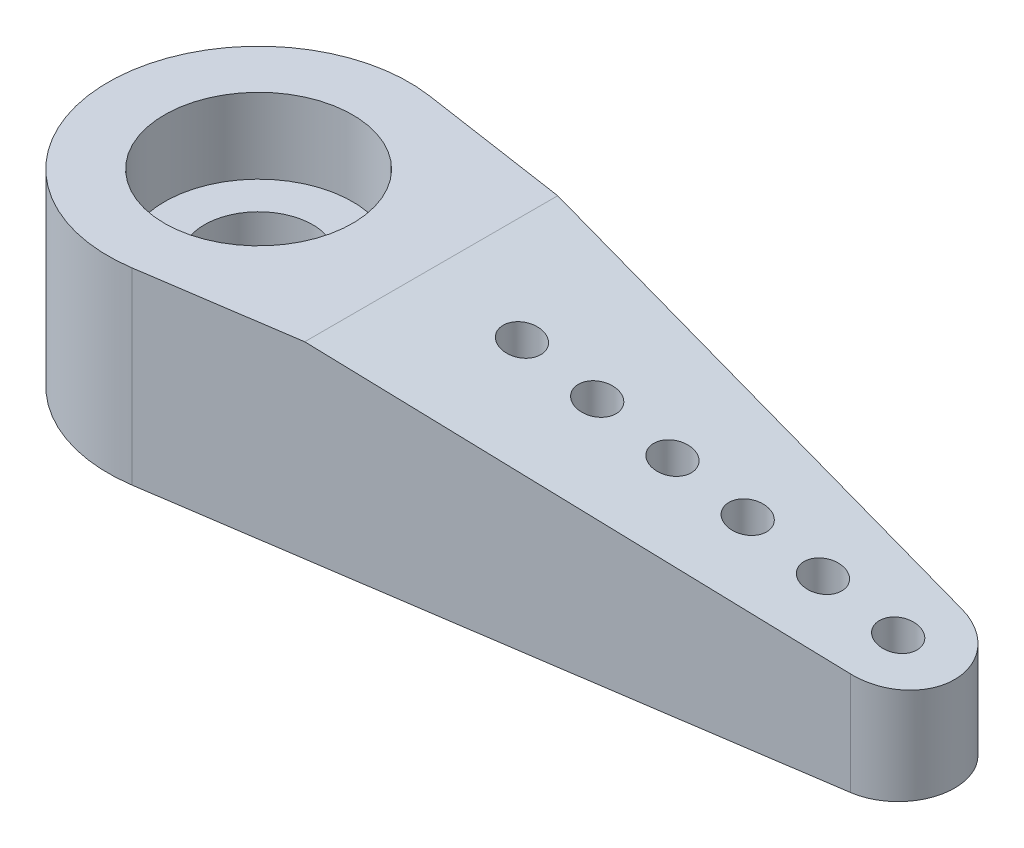
ISO-10303-21;
HEADER;
FILE_DESCRIPTION(('STEP AP214'),'2;1');
FILE_NAME('part.step','',(''),(''),'','','');
FILE_SCHEMA(('AUTOMOTIVE_DESIGN { 1 0 10303 214 1 1 1 1 }'));
ENDSEC;
DATA;
#1=APPLICATION_CONTEXT('core data for automotive mechanical design processes');
#2=APPLICATION_PROTOCOL_DEFINITION('international standard','automotive_design',2000,#1);
#3=PRODUCT_CONTEXT('',#1,'mechanical');
#4=PRODUCT('Part','Part','',(#3));
#5=PRODUCT_RELATED_PRODUCT_CATEGORY('part','',(#4));
#6=PRODUCT_DEFINITION_FORMATION('','',#4);
#7=PRODUCT_DEFINITION_CONTEXT('part definition',#1,'design');
#8=PRODUCT_DEFINITION('design','',#6,#7);
#9=PRODUCT_DEFINITION_SHAPE('','',#8);
#10=(LENGTH_UNIT() NAMED_UNIT(*) SI_UNIT(.MILLI.,.METRE.));
#11=(NAMED_UNIT(*) PLANE_ANGLE_UNIT() SI_UNIT($,.RADIAN.));
#12=(NAMED_UNIT(*) SI_UNIT($,.STERADIAN.) SOLID_ANGLE_UNIT());
#13=UNCERTAINTY_MEASURE_WITH_UNIT(LENGTH_MEASURE(1.E-05),#10,'distance_accuracy_value','');
#14=(GEOMETRIC_REPRESENTATION_CONTEXT(3) GLOBAL_UNCERTAINTY_ASSIGNED_CONTEXT((#13)) GLOBAL_UNIT_ASSIGNED_CONTEXT((#10,
#11,#12)) REPRESENTATION_CONTEXT('',''));
#15=CARTESIAN_POINT('',(0.,0.,0.));
#16=DIRECTION('',(0.,0.,1.));
#17=DIRECTION('',(1.,0.,0.));
#18=AXIS2_PLACEMENT_3D('',#15,#16,#17);
#19=CARTESIAN_POINT('',(0.,10.,0.));
#20=DIRECTION('',(0.,-1.,0.));
#21=DIRECTION('',(0.,0.,-1.));
#22=AXIS2_PLACEMENT_3D('',#19,#20,#21);
#23=CYLINDRICAL_SURFACE('',#22,8.);
#24=CARTESIAN_POINT('',(0.,0.,0.));
#25=DIRECTION('',(0.,1.,0.));
#26=DIRECTION('',(0.,0.,1.));
#27=AXIS2_PLACEMENT_3D('',#24,#25,#26);
#28=CIRCLE('',#27,8.);
#29=CARTESIAN_POINT('',(1.17647058823529,0.,-7.91302198625893));
#30=VERTEX_POINT('',#29);
#31=CARTESIAN_POINT('',(1.17647058823529,0.,7.91302198625893));
#32=VERTEX_POINT('',#31);
#33=EDGE_CURVE('E100',#30,#32,#28,.T.);
#34=ORIENTED_EDGE('',*,*,#33,.T.);
#35=DIRECTION('',(0.,-1.,0.));
#36=VECTOR('',#35,1.);
#37=CARTESIAN_POINT('',(1.17647058823529,10.,7.91302198625893));
#38=LINE('',#37,#36);
#39=CARTESIAN_POINT('',(1.17647058823529,10.,7.91302198625893));
#40=VERTEX_POINT('',#39);
#41=EDGE_CURVE('E48',#40,#32,#38,.T.);
#42=ORIENTED_EDGE('',*,*,#41,.F.);
#43=CARTESIAN_POINT('',(0.,10.,0.));
#44=DIRECTION('',(0.,1.,0.));
#45=DIRECTION('',(0.,0.,1.));
#46=AXIS2_PLACEMENT_3D('',#43,#44,#45);
#47=CIRCLE('',#46,8.);
#48=CARTESIAN_POINT('',(1.17647058823529,10.,-7.91302198625893));
#49=VERTEX_POINT('',#48);
#50=EDGE_CURVE('E94',#49,#40,#47,.T.);
#51=ORIENTED_EDGE('',*,*,#50,.F.);
#52=DIRECTION('',(0.,-1.,0.));
#53=VECTOR('',#52,1.);
#54=CARTESIAN_POINT('',(1.17647058823529,10.,-7.91302198625893));
#55=LINE('',#54,#53);
#56=EDGE_CURVE('E85',#49,#30,#55,.T.);
#57=ORIENTED_EDGE('',*,*,#56,.T.);
#58=EDGE_LOOP('',(#34,#42,#51,#57));
#59=FACE_BOUND('',#58,.T.);
#60=ADVANCED_FACE('F39',(#59),#23,.T.);
#61=CARTESIAN_POINT('',(1.17647058823529,10.,7.91302198625893));
#62=DIRECTION('',(-0.147058823529412,0.,-0.989127748282367));
#63=DIRECTION('',(-0.989127748282367,0.,0.147058823529412));
#64=AXIS2_PLACEMENT_3D('',#61,#62,#63);
#65=PLANE('',#64);
#66=DIRECTION('',(0.,-1.,0.));
#67=VECTOR('',#66,1.);
#68=CARTESIAN_POINT('',(34.4411764705882,10.,2.9673832448471));
#69=LINE('',#68,#67);
#70=CARTESIAN_POINT('',(34.4411764705882,5.45983086680761,2.9673832448471));
#71=VERTEX_POINT('',#70);
#72=CARTESIAN_POINT('',(34.4411764705882,0.,2.9673832448471));
#73=VERTEX_POINT('',#72);
#74=EDGE_CURVE('E123',#71,#73,#69,.T.);
#75=ORIENTED_EDGE('',*,*,#74,.F.);
#76=DIRECTION('',(-0.973862719348854,0.175007042589118,0.144789291408811));
#77=VECTOR('',#76,1.);
#78=CARTESIAN_POINT('',(1.42149030788161,11.3936011074631,7.87659361613661));
#79=LINE('',#78,#77);
#80=CARTESIAN_POINT('',(9.1764705882353,10.,6.72361991935883));
#81=VERTEX_POINT('',#80);
#82=EDGE_CURVE('E108',#71,#81,#79,.T.);
#83=ORIENTED_EDGE('',*,*,#82,.T.);
#84=DIRECTION('',(0.989127748282367,0.,-0.147058823529412));
#85=VECTOR('',#84,1.);
#86=CARTESIAN_POINT('',(1.17647058823529,10.,7.91302198625893));
#87=LINE('',#86,#85);
#88=EDGE_CURVE('E179',#40,#81,#87,.T.);
#89=ORIENTED_EDGE('',*,*,#88,.F.);
#90=ORIENTED_EDGE('',*,*,#41,.T.);
#91=DIRECTION('',(0.989127748282367,0.,-0.147058823529412));
#92=VECTOR('',#91,1.);
#93=CARTESIAN_POINT('',(1.17647058823529,0.,7.91302198625893));
#94=LINE('',#93,#92);
#95=EDGE_CURVE('E105',#32,#73,#94,.T.);
#96=ORIENTED_EDGE('',*,*,#95,.T.);
#97=EDGE_LOOP('',(#75,#83,#89,#90,#96));
#98=FACE_BOUND('',#97,.T.);
#99=ADVANCED_FACE('F189',(#98),#65,.F.);
#100=CARTESIAN_POINT('',(34.,10.,0.));
#101=DIRECTION('',(0.,-1.,0.));
#102=DIRECTION('',(0.,0.,-1.));
#103=AXIS2_PLACEMENT_3D('',#100,#101,#102);
#104=CYLINDRICAL_SURFACE('',#103,3.);
#105=DIRECTION('',(0.,-1.,0.));
#106=VECTOR('',#105,1.);
#107=CARTESIAN_POINT('',(34.4411764705882,10.,-2.9673832448471));
#108=LINE('',#107,#106);
#109=CARTESIAN_POINT('',(34.4411764705882,5.45983086680761,-2.9673832448471));
#110=VERTEX_POINT('',#109);
#111=CARTESIAN_POINT('',(34.4411764705882,0.,-2.9673832448471));
#112=VERTEX_POINT('',#111);
#113=EDGE_CURVE('E88',#110,#112,#108,.T.);
#114=ORIENTED_EDGE('',*,*,#113,.F.);
#115=CARTESIAN_POINT('',(34.,5.53911205073996,0.));
#116=DIRECTION('',(-0.176870816838534,-0.984234074877958,0.));
#117=DIRECTION('',(0.984234074877958,-0.176870816838534,0.));
#118=AXIS2_PLACEMENT_3D('',#115,#116,#117);
#119=ELLIPSE('',#118,3.04805541341575,3.);
#120=EDGE_CURVE('E114',#110,#71,#119,.T.);
#121=ORIENTED_EDGE('',*,*,#120,.T.);
#122=ORIENTED_EDGE('',*,*,#74,.T.);
#123=CARTESIAN_POINT('',(34.,0.,0.));
#124=DIRECTION('',(0.,1.,0.));
#125=DIRECTION('',(0.,0.,1.));
#126=AXIS2_PLACEMENT_3D('',#123,#124,#125);
#127=CIRCLE('',#126,3.);
#128=EDGE_CURVE('E95',#73,#112,#127,.T.);
#129=ORIENTED_EDGE('',*,*,#128,.T.);
#130=EDGE_LOOP('',(#114,#121,#122,#129));
#131=FACE_BOUND('',#130,.T.);
#132=ADVANCED_FACE('F193',(#131),#104,.T.);
#133=CARTESIAN_POINT('',(1.17647058823529,10.,-7.91302198625893));
#134=DIRECTION('',(-0.147058823529412,0.,0.989127748282367));
#135=DIRECTION('',(0.989127748282367,0.,0.147058823529412));
#136=AXIS2_PLACEMENT_3D('',#133,#134,#135);
#137=PLANE('',#136);
#138=DIRECTION('',(-0.989127748282367,0.,-0.147058823529412));
#139=VECTOR('',#138,1.);
#140=CARTESIAN_POINT('',(1.17647058823529,10.,-7.91302198625893));
#141=LINE('',#140,#139);
#142=CARTESIAN_POINT('',(9.17647058823529,10.,-6.72361991935883));
#143=VERTEX_POINT('',#142);
#144=EDGE_CURVE('E63',#143,#49,#141,.T.);
#145=ORIENTED_EDGE('',*,*,#144,.F.);
#146=DIRECTION('',(0.973862719348854,-0.175007042589118,0.144789291408811));
#147=VECTOR('',#146,1.);
#148=CARTESIAN_POINT('',(1.42149030788161,11.3936011074631,-7.87659361613661));
#149=LINE('',#148,#147);
#150=EDGE_CURVE('E55',#143,#110,#149,.T.);
#151=ORIENTED_EDGE('',*,*,#150,.T.);
#152=ORIENTED_EDGE('',*,*,#113,.T.);
#153=DIRECTION('',(-0.989127748282367,0.,-0.147058823529412));
#154=VECTOR('',#153,1.);
#155=CARTESIAN_POINT('',(1.17647058823529,0.,-7.91302198625893));
#156=LINE('',#155,#154);
#157=EDGE_CURVE('E82',#112,#30,#156,.T.);
#158=ORIENTED_EDGE('',*,*,#157,.T.);
#159=ORIENTED_EDGE('',*,*,#56,.F.);
#160=EDGE_LOOP('',(#145,#151,#152,#158,#159));
#161=FACE_BOUND('',#160,.T.);
#162=ADVANCED_FACE('F84',(#161),#137,.F.);
#163=CARTESIAN_POINT('',(0.,10.,0.));
#164=DIRECTION('',(0.,1.,0.));
#165=DIRECTION('',(0.,0.,1.));
#166=AXIS2_PLACEMENT_3D('',#163,#164,#165);
#167=PLANE('',#166);
#168=CARTESIAN_POINT('',(0.,10.,0.));
#169=DIRECTION('',(0.,1.,0.));
#170=DIRECTION('',(0.,0.,1.));
#171=AXIS2_PLACEMENT_3D('',#168,#169,#170);
#172=CIRCLE('',#171,5.);
#173=CARTESIAN_POINT('',(0.,10.,5.));
#174=VERTEX_POINT('',#173);
#175=EDGE_CURVE('E162',#174,#174,#172,.T.);
#176=ORIENTED_EDGE('',*,*,#175,.F.);
#177=EDGE_LOOP('',(#176));
#178=FACE_BOUND('',#177,.T.);
#179=DIRECTION('',(0.,0.,1.));
#180=VECTOR('',#179,1.);
#181=CARTESIAN_POINT('',(9.17647058823529,10.,0.));
#182=LINE('',#181,#180);
#183=EDGE_CURVE('E11',#143,#81,#182,.T.);
#184=ORIENTED_EDGE('',*,*,#183,.F.);
#185=ORIENTED_EDGE('',*,*,#144,.T.);
#186=ORIENTED_EDGE('',*,*,#50,.T.);
#187=ORIENTED_EDGE('',*,*,#88,.T.);
#188=EDGE_LOOP('',(#184,#185,#186,#187));
#189=FACE_BOUND('',#188,.T.);
#190=ADVANCED_FACE('F184',(#178,#189),#167,.T.);
#191=CARTESIAN_POINT('',(0.,0.,0.));
#192=DIRECTION('',(0.,1.,0.));
#193=DIRECTION('',(0.,0.,1.));
#194=AXIS2_PLACEMENT_3D('',#191,#192,#193);
#195=PLANE('',#194);
#196=CARTESIAN_POINT('',(34.,0.,0.));
#197=DIRECTION('',(0.,-1.,0.));
#198=DIRECTION('',(0.,0.,-1.));
#199=AXIS2_PLACEMENT_3D('',#196,#197,#198);
#200=CIRCLE('',#199,0.999999999999998);
#201=CARTESIAN_POINT('',(34.,0.,-0.999999999999998));
#202=VERTEX_POINT('',#201);
#203=EDGE_CURVE('E133',#202,#202,#200,.T.);
#204=ORIENTED_EDGE('',*,*,#203,.F.);
#205=EDGE_LOOP('',(#204));
#206=FACE_BOUND('',#205,.T.);
#207=CARTESIAN_POINT('',(30.,0.,0.));
#208=DIRECTION('',(0.,-1.,0.));
#209=DIRECTION('',(0.,0.,-1.));
#210=AXIS2_PLACEMENT_3D('',#207,#208,#209);
#211=CIRCLE('',#210,0.999999999999998);
#212=CARTESIAN_POINT('',(30.,0.,-1.00000000000003));
#213=VERTEX_POINT('',#212);
#214=EDGE_CURVE('E343',#213,#213,#211,.T.);
#215=ORIENTED_EDGE('',*,*,#214,.F.);
#216=EDGE_LOOP('',(#215));
#217=FACE_BOUND('',#216,.T.);
#218=CARTESIAN_POINT('',(26.,0.,0.));
#219=DIRECTION('',(0.,-1.,0.));
#220=DIRECTION('',(0.,0.,-1.));
#221=AXIS2_PLACEMENT_3D('',#218,#219,#220);
#222=CIRCLE('',#221,0.999999999999998);
#223=CARTESIAN_POINT('',(26.,0.,-1.00000000000005));
#224=VERTEX_POINT('',#223);
#225=EDGE_CURVE('E347',#224,#224,#222,.T.);
#226=ORIENTED_EDGE('',*,*,#225,.F.);
#227=EDGE_LOOP('',(#226));
#228=FACE_BOUND('',#227,.T.);
#229=CARTESIAN_POINT('',(22.,0.,0.));
#230=DIRECTION('',(0.,-1.,0.));
#231=DIRECTION('',(0.,0.,-1.));
#232=AXIS2_PLACEMENT_3D('',#229,#230,#231);
#233=CIRCLE('',#232,0.999999999999998);
#234=CARTESIAN_POINT('',(22.,0.,-1.00000000000008));
#235=VERTEX_POINT('',#234);
#236=EDGE_CURVE('E353',#235,#235,#233,.T.);
#237=ORIENTED_EDGE('',*,*,#236,.F.);
#238=EDGE_LOOP('',(#237));
#239=FACE_BOUND('',#238,.T.);
#240=CARTESIAN_POINT('',(18.,0.,-1.1172740284298E-13));
#241=DIRECTION('',(0.,-1.,0.));
#242=DIRECTION('',(0.,0.,-1.));
#243=AXIS2_PLACEMENT_3D('',#240,#241,#242);
#244=CIRCLE('',#243,0.999999999999998);
#245=CARTESIAN_POINT('',(18.,0.,-1.00000000000011));
#246=VERTEX_POINT('',#245);
#247=EDGE_CURVE('E357',#246,#246,#244,.T.);
#248=ORIENTED_EDGE('',*,*,#247,.F.);
#249=EDGE_LOOP('',(#248));
#250=FACE_BOUND('',#249,.T.);
#251=CARTESIAN_POINT('',(14.,0.,-1.39659253553725E-13));
#252=DIRECTION('',(0.,-1.,0.));
#253=DIRECTION('',(0.,0.,-1.));
#254=AXIS2_PLACEMENT_3D('',#251,#252,#253);
#255=CIRCLE('',#254,0.999999999999998);
#256=CARTESIAN_POINT('',(14.,0.,-1.00000000000014));
#257=VERTEX_POINT('',#256);
#258=EDGE_CURVE('E360',#257,#257,#255,.T.);
#259=ORIENTED_EDGE('',*,*,#258,.F.);
#260=EDGE_LOOP('',(#259));
#261=FACE_BOUND('',#260,.T.);
#262=CARTESIAN_POINT('',(0.,0.,0.));
#263=DIRECTION('',(0.,1.,0.));
#264=DIRECTION('',(0.,0.,1.));
#265=AXIS2_PLACEMENT_3D('',#262,#263,#264);
#266=CIRCLE('',#265,2.88);
#267=CARTESIAN_POINT('',(0.,0.,2.88));
#268=VERTEX_POINT('',#267);
#269=EDGE_CURVE('E156',#268,#268,#266,.T.);
#270=ORIENTED_EDGE('',*,*,#269,.T.);
#271=EDGE_LOOP('',(#270));
#272=FACE_BOUND('',#271,.T.);
#273=ORIENTED_EDGE('',*,*,#33,.F.);
#274=ORIENTED_EDGE('',*,*,#157,.F.);
#275=ORIENTED_EDGE('',*,*,#128,.F.);
#276=ORIENTED_EDGE('',*,*,#95,.F.);
#277=EDGE_LOOP('',(#273,#274,#275,#276));
#278=FACE_BOUND('',#277,.T.);
#279=ADVANCED_FACE('F103',(#206,#217,#228,#239,#250,#261,#272,#278),#195,.F.);
#280=CARTESIAN_POINT('',(37.,5.,-8.));
#281=DIRECTION('',(-0.176870816838534,-0.984234074877958,0.));
#282=DIRECTION('',(0.984234074877958,-0.176870816838534,0.));
#283=AXIS2_PLACEMENT_3D('',#280,#281,#282);
#284=PLANE('',#283);
#285=CARTESIAN_POINT('',(34.,5.53911205073996,0.));
#286=DIRECTION('',(-0.176870816838534,-0.984234074877958,0.));
#287=DIRECTION('',(0.984234074877958,-0.176870816838534,0.));
#288=AXIS2_PLACEMENT_3D('',#285,#286,#287);
#289=ELLIPSE('',#288,1.01601847113858,0.999999999999998);
#290=CARTESIAN_POINT('',(35.,5.35940803382664,0.));
#291=VERTEX_POINT('',#290);
#292=EDGE_CURVE('E42',#291,#291,#289,.T.);
#293=ORIENTED_EDGE('',*,*,#292,.T.);
#294=EDGE_LOOP('',(#293));
#295=FACE_BOUND('',#294,.T.);
#296=CARTESIAN_POINT('',(30.,6.25792811839323,0.));
#297=DIRECTION('',(-0.176870816838534,-0.984234074877958,0.));
#298=DIRECTION('',(0.984234074877958,-0.176870816838534,0.));
#299=AXIS2_PLACEMENT_3D('',#296,#297,#298);
#300=ELLIPSE('',#299,1.01601847113858,0.999999999999998);
#301=CARTESIAN_POINT('',(31.,6.07822410147991,0.));
#302=VERTEX_POINT('',#301);
#303=EDGE_CURVE('E144',#302,#302,#300,.T.);
#304=ORIENTED_EDGE('',*,*,#303,.T.);
#305=EDGE_LOOP('',(#304));
#306=FACE_BOUND('',#305,.T.);
#307=CARTESIAN_POINT('',(26.,6.97674418604651,0.));
#308=DIRECTION('',(-0.176870816838534,-0.984234074877958,0.));
#309=DIRECTION('',(0.984234074877958,-0.176870816838534,0.));
#310=AXIS2_PLACEMENT_3D('',#307,#308,#309);
#311=ELLIPSE('',#310,1.01601847113858,0.999999999999998);
#312=CARTESIAN_POINT('',(27.,6.79704016913319,0.));
#313=VERTEX_POINT('',#312);
#314=EDGE_CURVE('E141',#313,#313,#311,.T.);
#315=ORIENTED_EDGE('',*,*,#314,.T.);
#316=EDGE_LOOP('',(#315));
#317=FACE_BOUND('',#316,.T.);
#318=CARTESIAN_POINT('',(22.,7.69556025369979,0.));
#319=DIRECTION('',(-0.176870816838534,-0.984234074877958,0.));
#320=DIRECTION('',(0.984234074877958,-0.176870816838534,0.));
#321=AXIS2_PLACEMENT_3D('',#318,#319,#320);
#322=ELLIPSE('',#321,1.01601847113858,0.999999999999998);
#323=CARTESIAN_POINT('',(23.,7.51585623678647,0.));
#324=VERTEX_POINT('',#323);
#325=EDGE_CURVE('E137',#324,#324,#322,.T.);
#326=ORIENTED_EDGE('',*,*,#325,.T.);
#327=EDGE_LOOP('',(#326));
#328=FACE_BOUND('',#327,.T.);
#329=CARTESIAN_POINT('',(18.,8.41437632135306,-1.1172740284298E-13));
#330=DIRECTION('',(-0.176870816838534,-0.984234074877958,0.));
#331=DIRECTION('',(0.984234074877958,-0.176870816838534,0.));
#332=AXIS2_PLACEMENT_3D('',#329,#330,#331);
#333=ELLIPSE('',#332,1.01601847113858,0.999999999999998);
#334=CARTESIAN_POINT('',(19.,8.23467230443974,-1.1172740284298E-13));
#335=VERTEX_POINT('',#334);
#336=EDGE_CURVE('E132',#335,#335,#333,.T.);
#337=ORIENTED_EDGE('',*,*,#336,.T.);
#338=EDGE_LOOP('',(#337));
#339=FACE_BOUND('',#338,.T.);
#340=CARTESIAN_POINT('',(14.,9.13319238900634,-1.39659253553725E-13));
#341=DIRECTION('',(-0.176870816838534,-0.984234074877958,0.));
#342=DIRECTION('',(0.984234074877958,-0.176870816838534,0.));
#343=AXIS2_PLACEMENT_3D('',#340,#341,#342);
#344=ELLIPSE('',#343,1.01601847113858,0.999999999999998);
#345=CARTESIAN_POINT('',(15.,8.95348837209302,-1.39659253553725E-13));
#346=VERTEX_POINT('',#345);
#347=EDGE_CURVE('E128',#346,#346,#344,.T.);
#348=ORIENTED_EDGE('',*,*,#347,.T.);
#349=EDGE_LOOP('',(#348));
#350=FACE_BOUND('',#349,.T.);
#351=ORIENTED_EDGE('',*,*,#120,.F.);
#352=ORIENTED_EDGE('',*,*,#150,.F.);
#353=ORIENTED_EDGE('',*,*,#183,.T.);
#354=ORIENTED_EDGE('',*,*,#82,.F.);
#355=EDGE_LOOP('',(#351,#352,#353,#354));
#356=FACE_BOUND('',#355,.T.);
#357=ADVANCED_FACE('F191',(#295,#306,#317,#328,#339,#350,#356),#284,.F.);
#358=CARTESIAN_POINT('',(0.,6.,0.));
#359=DIRECTION('',(0.,1.,0.));
#360=DIRECTION('',(0.,0.,1.));
#361=AXIS2_PLACEMENT_3D('',#358,#359,#360);
#362=CYLINDRICAL_SURFACE('',#361,5.);
#363=CARTESIAN_POINT('',(0.,6.,0.));
#364=DIRECTION('',(0.,1.,0.));
#365=DIRECTION('',(0.,0.,1.));
#366=AXIS2_PLACEMENT_3D('',#363,#364,#365);
#367=CIRCLE('',#366,5.);
#368=CARTESIAN_POINT('',(0.,6.,5.));
#369=VERTEX_POINT('',#368);
#370=EDGE_CURVE('E166',#369,#369,#367,.T.);
#371=ORIENTED_EDGE('',*,*,#370,.F.);
#372=EDGE_LOOP('',(#371));
#373=FACE_BOUND('',#372,.T.);
#374=ORIENTED_EDGE('',*,*,#175,.T.);
#375=EDGE_LOOP('',(#374));
#376=FACE_BOUND('',#375,.T.);
#377=ADVANCED_FACE('F235',(#373,#376),#362,.F.);
#378=CARTESIAN_POINT('',(0.,6.,0.));
#379=DIRECTION('',(0.,1.,0.));
#380=DIRECTION('',(0.,0.,1.));
#381=AXIS2_PLACEMENT_3D('',#378,#379,#380);
#382=PLANE('',#381);
#383=CARTESIAN_POINT('',(0.,6.,0.));
#384=DIRECTION('',(0.,1.,0.));
#385=DIRECTION('',(0.,0.,1.));
#386=AXIS2_PLACEMENT_3D('',#383,#384,#385);
#387=CIRCLE('',#386,2.88);
#388=CARTESIAN_POINT('',(0.,6.,2.88));
#389=VERTEX_POINT('',#388);
#390=EDGE_CURVE('E151',#389,#389,#387,.T.);
#391=ORIENTED_EDGE('',*,*,#390,.F.);
#392=EDGE_LOOP('',(#391));
#393=FACE_BOUND('',#392,.T.);
#394=ORIENTED_EDGE('',*,*,#370,.T.);
#395=EDGE_LOOP('',(#394));
#396=FACE_BOUND('',#395,.T.);
#397=ADVANCED_FACE('F240',(#393,#396),#382,.T.);
#398=CARTESIAN_POINT('',(0.,0.,0.));
#399=DIRECTION('',(0.,1.,0.));
#400=DIRECTION('',(0.,0.,1.));
#401=AXIS2_PLACEMENT_3D('',#398,#399,#400);
#402=CYLINDRICAL_SURFACE('',#401,2.88);
#403=ORIENTED_EDGE('',*,*,#269,.F.);
#404=EDGE_LOOP('',(#403));
#405=FACE_BOUND('',#404,.T.);
#406=ORIENTED_EDGE('',*,*,#390,.T.);
#407=EDGE_LOOP('',(#406));
#408=FACE_BOUND('',#407,.T.);
#409=ADVANCED_FACE('F252',(#405,#408),#402,.F.);
#410=CARTESIAN_POINT('',(14.,10.,-1.39659253553725E-13));
#411=DIRECTION('',(0.,-1.,0.));
#412=DIRECTION('',(0.,0.,-1.));
#413=AXIS2_PLACEMENT_3D('',#410,#411,#412);
#414=CYLINDRICAL_SURFACE('',#413,0.999999999999998);
#415=ORIENTED_EDGE('',*,*,#258,.T.);
#416=EDGE_LOOP('',(#415));
#417=FACE_BOUND('',#416,.T.);
#418=ORIENTED_EDGE('',*,*,#347,.F.);
#419=EDGE_LOOP('',(#418));
#420=FACE_BOUND('',#419,.T.);
#421=ADVANCED_FACE('F262',(#417,#420),#414,.F.);
#422=CARTESIAN_POINT('',(18.,10.,-1.1172740284298E-13));
#423=DIRECTION('',(0.,-1.,0.));
#424=DIRECTION('',(0.,0.,-1.));
#425=AXIS2_PLACEMENT_3D('',#422,#423,#424);
#426=CYLINDRICAL_SURFACE('',#425,0.999999999999998);
#427=ORIENTED_EDGE('',*,*,#247,.T.);
#428=EDGE_LOOP('',(#427));
#429=FACE_BOUND('',#428,.T.);
#430=ORIENTED_EDGE('',*,*,#336,.F.);
#431=EDGE_LOOP('',(#430));
#432=FACE_BOUND('',#431,.T.);
#433=ADVANCED_FACE('F285',(#429,#432),#426,.F.);
#434=CARTESIAN_POINT('',(22.,10.,0.));
#435=DIRECTION('',(0.,-1.,0.));
#436=DIRECTION('',(0.,0.,-1.));
#437=AXIS2_PLACEMENT_3D('',#434,#435,#436);
#438=CYLINDRICAL_SURFACE('',#437,0.999999999999998);
#439=ORIENTED_EDGE('',*,*,#236,.T.);
#440=EDGE_LOOP('',(#439));
#441=FACE_BOUND('',#440,.T.);
#442=ORIENTED_EDGE('',*,*,#325,.F.);
#443=EDGE_LOOP('',(#442));
#444=FACE_BOUND('',#443,.T.);
#445=ADVANCED_FACE('F295',(#441,#444),#438,.F.);
#446=CARTESIAN_POINT('',(26.,10.,0.));
#447=DIRECTION('',(0.,-1.,0.));
#448=DIRECTION('',(0.,0.,-1.));
#449=AXIS2_PLACEMENT_3D('',#446,#447,#448);
#450=CYLINDRICAL_SURFACE('',#449,0.999999999999998);
#451=ORIENTED_EDGE('',*,*,#225,.T.);
#452=EDGE_LOOP('',(#451));
#453=FACE_BOUND('',#452,.T.);
#454=ORIENTED_EDGE('',*,*,#314,.F.);
#455=EDGE_LOOP('',(#454));
#456=FACE_BOUND('',#455,.T.);
#457=ADVANCED_FACE('F305',(#453,#456),#450,.F.);
#458=CARTESIAN_POINT('',(30.,10.,0.));
#459=DIRECTION('',(0.,-1.,0.));
#460=DIRECTION('',(0.,0.,-1.));
#461=AXIS2_PLACEMENT_3D('',#458,#459,#460);
#462=CYLINDRICAL_SURFACE('',#461,0.999999999999998);
#463=ORIENTED_EDGE('',*,*,#214,.T.);
#464=EDGE_LOOP('',(#463));
#465=FACE_BOUND('',#464,.T.);
#466=ORIENTED_EDGE('',*,*,#303,.F.);
#467=EDGE_LOOP('',(#466));
#468=FACE_BOUND('',#467,.T.);
#469=ADVANCED_FACE('F315',(#465,#468),#462,.F.);
#470=CARTESIAN_POINT('',(34.,10.,0.));
#471=DIRECTION('',(0.,-1.,0.));
#472=DIRECTION('',(0.,0.,-1.));
#473=AXIS2_PLACEMENT_3D('',#470,#471,#472);
#474=CYLINDRICAL_SURFACE('',#473,0.999999999999998);
#475=ORIENTED_EDGE('',*,*,#203,.T.);
#476=EDGE_LOOP('',(#475));
#477=FACE_BOUND('',#476,.T.);
#478=ORIENTED_EDGE('',*,*,#292,.F.);
#479=EDGE_LOOP('',(#478));
#480=FACE_BOUND('',#479,.T.);
#481=ADVANCED_FACE('F325',(#477,#480),#474,.F.);
#482=CLOSED_SHELL('',(#60,#99,#132,#162,#190,#279,#357,#377,#397,#409,#421,#433,#445,#457,#469,#481));
#483=MANIFOLD_SOLID_BREP('B2',#482);
#484=ADVANCED_BREP_SHAPE_REPRESENTATION('',(#18,#483),#14);
#485=SHAPE_DEFINITION_REPRESENTATION(#9,#484);
ENDSEC;
END-ISO-10303-21;
